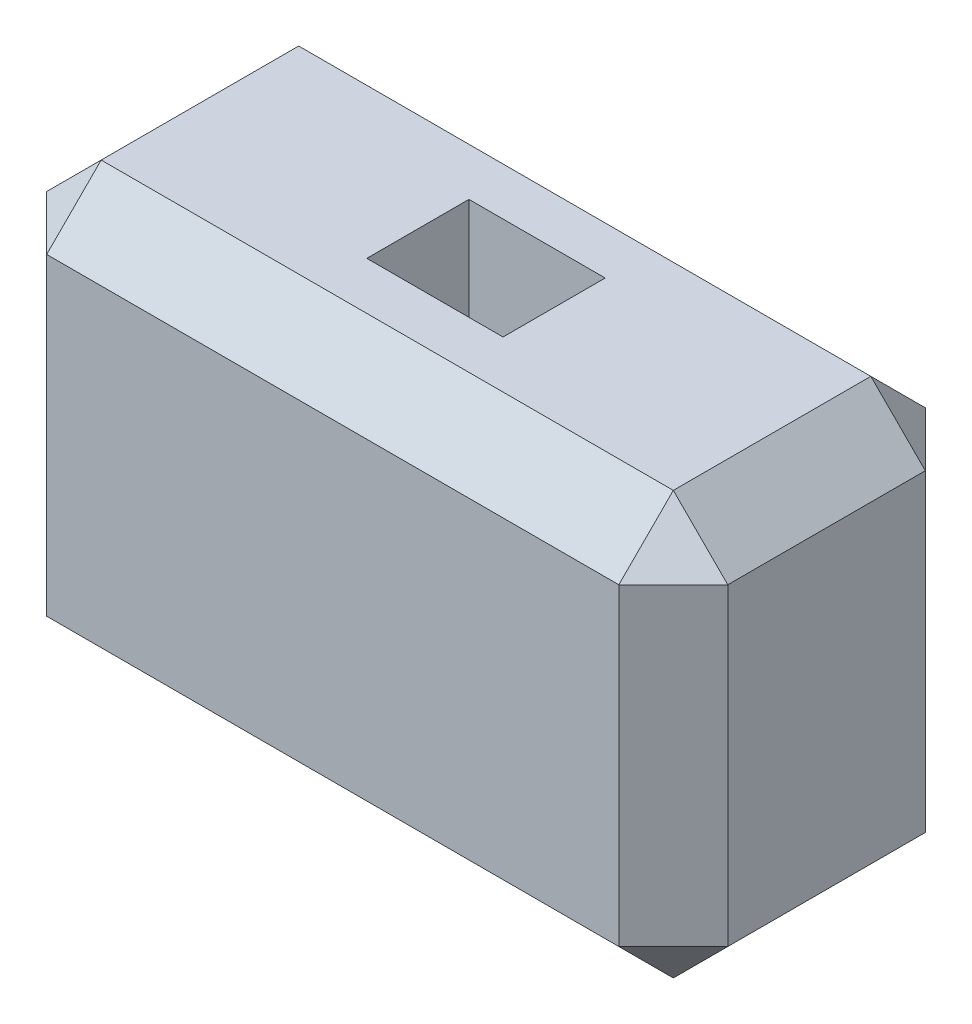
ISO-10303-21;
HEADER;
FILE_DESCRIPTION(('STEP AP214'),'2;1');
FILE_NAME('part.step','',(''),(''),'','','');
FILE_SCHEMA(('AUTOMOTIVE_DESIGN { 1 0 10303 214 1 1 1 1 }'));
ENDSEC;
DATA;
#1=APPLICATION_CONTEXT('core data for automotive mechanical design processes');
#2=APPLICATION_PROTOCOL_DEFINITION('international standard','automotive_design',2000,#1);
#3=PRODUCT_CONTEXT('',#1,'mechanical');
#4=PRODUCT('Part','Part','',(#3));
#5=PRODUCT_RELATED_PRODUCT_CATEGORY('part','',(#4));
#6=PRODUCT_DEFINITION_FORMATION('','',#4);
#7=PRODUCT_DEFINITION_CONTEXT('part definition',#1,'design');
#8=PRODUCT_DEFINITION('design','',#6,#7);
#9=PRODUCT_DEFINITION_SHAPE('','',#8);
#10=(LENGTH_UNIT() NAMED_UNIT(*) SI_UNIT(.MILLI.,.METRE.));
#11=(NAMED_UNIT(*) PLANE_ANGLE_UNIT() SI_UNIT($,.RADIAN.));
#12=(NAMED_UNIT(*) SI_UNIT($,.STERADIAN.) SOLID_ANGLE_UNIT());
#13=UNCERTAINTY_MEASURE_WITH_UNIT(LENGTH_MEASURE(1.E-05),#10,'distance_accuracy_value','');
#14=(GEOMETRIC_REPRESENTATION_CONTEXT(3) GLOBAL_UNCERTAINTY_ASSIGNED_CONTEXT((#13)) GLOBAL_UNIT_ASSIGNED_CONTEXT((#10,
#11,#12)) REPRESENTATION_CONTEXT('',''));
#15=CARTESIAN_POINT('',(0.,0.,0.));
#16=DIRECTION('',(0.,0.,1.));
#17=DIRECTION('',(1.,0.,0.));
#18=AXIS2_PLACEMENT_3D('',#15,#16,#17);
#19=CARTESIAN_POINT('',(0.,0.,19.05));
#20=DIRECTION('',(0.,0.,-1.));
#21=DIRECTION('',(-1.,0.,0.));
#22=AXIS2_PLACEMENT_3D('',#19,#20,#21);
#23=PLANE('',#22);
#24=DIRECTION('',(0.,-1.,0.));
#25=VECTOR('',#24,1.);
#26=CARTESIAN_POINT('',(12.7,39.37,19.05));
#27=LINE('',#26,#25);
#28=CARTESIAN_POINT('',(12.7,39.37,19.05));
#29=VERTEX_POINT('',#28);
#30=CARTESIAN_POINT('',(12.7,-39.37,19.05));
#31=VERTEX_POINT('',#30);
#32=EDGE_CURVE('E157',#29,#31,#27,.T.);
#33=ORIENTED_EDGE('',*,*,#32,.F.);
#34=DIRECTION('',(-1.,0.,0.));
#35=VECTOR('',#34,1.);
#36=CARTESIAN_POINT('',(-63.5,39.37,19.05));
#37=LINE('',#36,#35);
#38=CARTESIAN_POINT('',(-12.7,39.37,19.05));
#39=VERTEX_POINT('',#38);
#40=EDGE_CURVE('E165',#29,#39,#37,.T.);
#41=ORIENTED_EDGE('',*,*,#40,.T.);
#42=DIRECTION('',(0.,1.,0.));
#43=VECTOR('',#42,1.);
#44=CARTESIAN_POINT('',(-12.7,39.37,19.05));
#45=LINE('',#44,#43);
#46=CARTESIAN_POINT('',(-12.7,-39.37,19.05));
#47=VERTEX_POINT('',#46);
#48=EDGE_CURVE('E166',#47,#39,#45,.T.);
#49=ORIENTED_EDGE('',*,*,#48,.F.);
#50=DIRECTION('',(1.,0.,0.));
#51=VECTOR('',#50,1.);
#52=CARTESIAN_POINT('',(-63.5,-39.37,19.05));
#53=LINE('',#52,#51);
#54=EDGE_CURVE('E188',#47,#31,#53,.T.);
#55=ORIENTED_EDGE('',*,*,#54,.T.);
#56=EDGE_LOOP('',(#33,#41,#49,#55));
#57=FACE_BOUND('',#56,.T.);
#58=ADVANCED_FACE('F33',(#57),#23,.F.);
#59=CARTESIAN_POINT('',(63.5,-39.37,19.05));
#60=DIRECTION('',(-1.,0.,0.));
#61=DIRECTION('',(0.,0.,1.));
#62=AXIS2_PLACEMENT_3D('',#59,#60,#61);
#63=PLANE('',#62);
#64=DIRECTION('',(0.,-1.,0.));
#65=VECTOR('',#64,1.);
#66=CARTESIAN_POINT('',(63.5,-39.37,46.99));
#67=LINE('',#66,#65);
#68=CARTESIAN_POINT('',(63.5,29.21,46.99));
#69=VERTEX_POINT('',#68);
#70=CARTESIAN_POINT('',(63.5,-29.21,46.99));
#71=VERTEX_POINT('',#70);
#72=EDGE_CURVE('E234',#69,#71,#67,.T.);
#73=ORIENTED_EDGE('',*,*,#72,.T.);
#74=DIRECTION('',(0.,0.,-1.));
#75=VECTOR('',#74,1.);
#76=CARTESIAN_POINT('',(63.5,-29.21,19.05));
#77=LINE('',#76,#75);
#78=CARTESIAN_POINT('',(63.5,-29.21,10.16));
#79=VERTEX_POINT('',#78);
#80=EDGE_CURVE('E240',#71,#79,#77,.T.);
#81=ORIENTED_EDGE('',*,*,#80,.T.);
#82=DIRECTION('',(0.,1.,0.));
#83=VECTOR('',#82,1.);
#84=CARTESIAN_POINT('',(63.5,39.37,10.16));
#85=LINE('',#84,#83);
#86=CARTESIAN_POINT('',(63.5,29.21,10.16));
#87=VERTEX_POINT('',#86);
#88=EDGE_CURVE('E238',#79,#87,#85,.T.);
#89=ORIENTED_EDGE('',*,*,#88,.T.);
#90=DIRECTION('',(0.,0.,1.));
#91=VECTOR('',#90,1.);
#92=CARTESIAN_POINT('',(63.5,29.21,19.05));
#93=LINE('',#92,#91);
#94=EDGE_CURVE('E236',#87,#69,#93,.T.);
#95=ORIENTED_EDGE('',*,*,#94,.T.);
#96=EDGE_LOOP('',(#73,#81,#89,#95));
#97=FACE_BOUND('',#96,.T.);
#98=ADVANCED_FACE('F328',(#97),#63,.F.);
#99=CARTESIAN_POINT('',(-63.5,39.37,19.05));
#100=DIRECTION('',(0.,-1.,0.));
#101=DIRECTION('',(0.,0.,-1.));
#102=AXIS2_PLACEMENT_3D('',#99,#100,#101);
#103=PLANE('',#102);
#104=DIRECTION('',(1.,0.,0.));
#105=VECTOR('',#104,1.);
#106=CARTESIAN_POINT('',(63.5,39.37,46.99));
#107=LINE('',#106,#105);
#108=CARTESIAN_POINT('',(-53.34,39.37,46.99));
#109=VERTEX_POINT('',#108);
#110=CARTESIAN_POINT('',(53.34,39.37,46.99));
#111=VERTEX_POINT('',#110);
#112=EDGE_CURVE('E200',#109,#111,#107,.T.);
#113=ORIENTED_EDGE('',*,*,#112,.T.);
#114=DIRECTION('',(0.,0.,-1.));
#115=VECTOR('',#114,1.);
#116=CARTESIAN_POINT('',(53.34,39.37,19.05));
#117=LINE('',#116,#115);
#118=CARTESIAN_POINT('',(53.34,39.37,10.16));
#119=VERTEX_POINT('',#118);
#120=EDGE_CURVE('E205',#111,#119,#117,.T.);
#121=ORIENTED_EDGE('',*,*,#120,.T.);
#122=DIRECTION('',(-1.,0.,0.));
#123=VECTOR('',#122,1.);
#124=CARTESIAN_POINT('',(-63.5,39.37,10.16));
#125=LINE('',#124,#123);
#126=CARTESIAN_POINT('',(-53.34,39.37,10.16));
#127=VERTEX_POINT('',#126);
#128=EDGE_CURVE('E202',#119,#127,#125,.T.);
#129=ORIENTED_EDGE('',*,*,#128,.T.);
#130=DIRECTION('',(0.,0.,1.));
#131=VECTOR('',#130,1.);
#132=CARTESIAN_POINT('',(-53.34,39.37,19.05));
#133=LINE('',#132,#131);
#134=EDGE_CURVE('E198',#127,#109,#133,.T.);
#135=ORIENTED_EDGE('',*,*,#134,.T.);
#136=EDGE_LOOP('',(#113,#121,#129,#135));
#137=FACE_BOUND('',#136,.T.);
#138=DIRECTION('',(-1.,0.,0.));
#139=VECTOR('',#138,1.);
#140=CARTESIAN_POINT('',(-63.5,39.37,38.1));
#141=LINE('',#140,#139);
#142=CARTESIAN_POINT('',(12.7,39.37,38.1));
#143=VERTEX_POINT('',#142);
#144=CARTESIAN_POINT('',(-12.7,39.37,38.1));
#145=VERTEX_POINT('',#144);
#146=EDGE_CURVE('E164',#143,#145,#141,.T.);
#147=ORIENTED_EDGE('',*,*,#146,.T.);
#148=DIRECTION('',(0.,0.,-1.));
#149=VECTOR('',#148,1.);
#150=CARTESIAN_POINT('',(-12.7,39.37,38.1));
#151=LINE('',#150,#149);
#152=EDGE_CURVE('E179',#145,#39,#151,.T.);
#153=ORIENTED_EDGE('',*,*,#152,.T.);
#154=ORIENTED_EDGE('',*,*,#40,.F.);
#155=DIRECTION('',(0.,0.,-1.));
#156=VECTOR('',#155,1.);
#157=CARTESIAN_POINT('',(12.7,39.37,38.1));
#158=LINE('',#157,#156);
#159=EDGE_CURVE('E150',#143,#29,#158,.T.);
#160=ORIENTED_EDGE('',*,*,#159,.F.);
#161=EDGE_LOOP('',(#147,#153,#154,#160));
#162=FACE_BOUND('',#161,.T.);
#163=ADVANCED_FACE('F162',(#137,#162),#103,.F.);
#164=CARTESIAN_POINT('',(-63.5,-39.37,19.05));
#165=DIRECTION('',(1.,0.,0.));
#166=DIRECTION('',(0.,0.,-1.));
#167=AXIS2_PLACEMENT_3D('',#164,#165,#166);
#168=PLANE('',#167);
#169=DIRECTION('',(0.,1.,0.));
#170=VECTOR('',#169,1.);
#171=CARTESIAN_POINT('',(-63.5,39.37,46.99));
#172=LINE('',#171,#170);
#173=CARTESIAN_POINT('',(-63.5,-29.21,46.99));
#174=VERTEX_POINT('',#173);
#175=CARTESIAN_POINT('',(-63.5,29.21,46.99));
#176=VERTEX_POINT('',#175);
#177=EDGE_CURVE('E42',#174,#176,#172,.T.);
#178=ORIENTED_EDGE('',*,*,#177,.T.);
#179=DIRECTION('',(0.,0.,-1.));
#180=VECTOR('',#179,1.);
#181=CARTESIAN_POINT('',(-63.5,29.21,19.05));
#182=LINE('',#181,#180);
#183=CARTESIAN_POINT('',(-63.5,29.21,10.16));
#184=VERTEX_POINT('',#183);
#185=EDGE_CURVE('E11',#176,#184,#182,.T.);
#186=ORIENTED_EDGE('',*,*,#185,.T.);
#187=DIRECTION('',(0.,-1.,0.));
#188=VECTOR('',#187,1.);
#189=CARTESIAN_POINT('',(-63.5,-39.37,10.16));
#190=LINE('',#189,#188);
#191=CARTESIAN_POINT('',(-63.5,-29.21,10.16));
#192=VERTEX_POINT('',#191);
#193=EDGE_CURVE('E243',#184,#192,#190,.T.);
#194=ORIENTED_EDGE('',*,*,#193,.T.);
#195=DIRECTION('',(0.,0.,1.));
#196=VECTOR('',#195,1.);
#197=CARTESIAN_POINT('',(-63.5,-29.21,19.05));
#198=LINE('',#197,#196);
#199=EDGE_CURVE('E53',#192,#174,#198,.T.);
#200=ORIENTED_EDGE('',*,*,#199,.T.);
#201=EDGE_LOOP('',(#178,#186,#194,#200));
#202=FACE_BOUND('',#201,.T.);
#203=ADVANCED_FACE('F407',(#202),#168,.F.);
#204=CARTESIAN_POINT('',(-63.5,-39.37,19.05));
#205=DIRECTION('',(0.,1.,0.));
#206=DIRECTION('',(0.,0.,1.));
#207=AXIS2_PLACEMENT_3D('',#204,#205,#206);
#208=PLANE('',#207);
#209=DIRECTION('',(0.,0.,-1.));
#210=VECTOR('',#209,1.);
#211=CARTESIAN_POINT('',(-53.34,-39.37,19.05));
#212=LINE('',#211,#210);
#213=CARTESIAN_POINT('',(-53.34,-39.37,46.99));
#214=VERTEX_POINT('',#213);
#215=CARTESIAN_POINT('',(-53.34,-39.37,10.16));
#216=VERTEX_POINT('',#215);
#217=EDGE_CURVE('E216',#214,#216,#212,.T.);
#218=ORIENTED_EDGE('',*,*,#217,.T.);
#219=DIRECTION('',(1.,0.,0.));
#220=VECTOR('',#219,1.);
#221=CARTESIAN_POINT('',(63.5,-39.37,10.16));
#222=LINE('',#221,#220);
#223=CARTESIAN_POINT('',(53.34,-39.37,10.16));
#224=VERTEX_POINT('',#223);
#225=EDGE_CURVE('E222',#216,#224,#222,.T.);
#226=ORIENTED_EDGE('',*,*,#225,.T.);
#227=DIRECTION('',(0.,0.,1.));
#228=VECTOR('',#227,1.);
#229=CARTESIAN_POINT('',(53.34,-39.37,19.05));
#230=LINE('',#229,#228);
#231=CARTESIAN_POINT('',(53.34,-39.37,46.99));
#232=VERTEX_POINT('',#231);
#233=EDGE_CURVE('E220',#224,#232,#230,.T.);
#234=ORIENTED_EDGE('',*,*,#233,.T.);
#235=DIRECTION('',(-1.,0.,0.));
#236=VECTOR('',#235,1.);
#237=CARTESIAN_POINT('',(-63.5,-39.37,46.99));
#238=LINE('',#237,#236);
#239=EDGE_CURVE('E218',#232,#214,#238,.T.);
#240=ORIENTED_EDGE('',*,*,#239,.T.);
#241=EDGE_LOOP('',(#218,#226,#234,#240));
#242=FACE_BOUND('',#241,.T.);
#243=DIRECTION('',(0.,0.,-1.));
#244=VECTOR('',#243,1.);
#245=CARTESIAN_POINT('',(-12.7,-39.37,38.1));
#246=LINE('',#245,#244);
#247=CARTESIAN_POINT('',(-12.7,-39.37,38.1));
#248=VERTEX_POINT('',#247);
#249=EDGE_CURVE('E190',#248,#47,#246,.T.);
#250=ORIENTED_EDGE('',*,*,#249,.F.);
#251=DIRECTION('',(1.,0.,0.));
#252=VECTOR('',#251,1.);
#253=CARTESIAN_POINT('',(-63.5,-39.37,38.1));
#254=LINE('',#253,#252);
#255=CARTESIAN_POINT('',(12.7,-39.37,38.1));
#256=VERTEX_POINT('',#255);
#257=EDGE_CURVE('E172',#248,#256,#254,.T.);
#258=ORIENTED_EDGE('',*,*,#257,.T.);
#259=DIRECTION('',(0.,0.,-1.));
#260=VECTOR('',#259,1.);
#261=CARTESIAN_POINT('',(12.7,-39.37,38.1));
#262=LINE('',#261,#260);
#263=EDGE_CURVE('E152',#256,#31,#262,.T.);
#264=ORIENTED_EDGE('',*,*,#263,.T.);
#265=ORIENTED_EDGE('',*,*,#54,.F.);
#266=EDGE_LOOP('',(#250,#258,#264,#265));
#267=FACE_BOUND('',#266,.T.);
#268=ADVANCED_FACE('F355',(#242,#267),#208,.F.);
#269=CARTESIAN_POINT('',(0.,0.,0.));
#270=DIRECTION('',(0.,0.,-1.));
#271=DIRECTION('',(-1.,0.,0.));
#272=AXIS2_PLACEMENT_3D('',#269,#270,#271);
#273=PLANE('',#272);
#274=DIRECTION('',(1.,0.,0.));
#275=VECTOR('',#274,1.);
#276=CARTESIAN_POINT('',(63.5,29.21,0.));
#277=LINE('',#276,#275);
#278=CARTESIAN_POINT('',(-53.34,29.21,0.));
#279=VERTEX_POINT('',#278);
#280=CARTESIAN_POINT('',(53.34,29.21,0.));
#281=VERTEX_POINT('',#280);
#282=EDGE_CURVE('E211',#279,#281,#277,.T.);
#283=ORIENTED_EDGE('',*,*,#282,.T.);
#284=DIRECTION('',(0.,-1.,0.));
#285=VECTOR('',#284,1.);
#286=CARTESIAN_POINT('',(53.34,-39.37,0.));
#287=LINE('',#286,#285);
#288=CARTESIAN_POINT('',(53.34,-29.21,0.));
#289=VERTEX_POINT('',#288);
#290=EDGE_CURVE('E214',#281,#289,#287,.T.);
#291=ORIENTED_EDGE('',*,*,#290,.T.);
#292=DIRECTION('',(-1.,0.,0.));
#293=VECTOR('',#292,1.);
#294=CARTESIAN_POINT('',(-63.5,-29.21,0.));
#295=LINE('',#294,#293);
#296=CARTESIAN_POINT('',(-53.34,-29.21,0.));
#297=VERTEX_POINT('',#296);
#298=EDGE_CURVE('E209',#289,#297,#295,.T.);
#299=ORIENTED_EDGE('',*,*,#298,.T.);
#300=DIRECTION('',(0.,1.,0.));
#301=VECTOR('',#300,1.);
#302=CARTESIAN_POINT('',(-53.34,39.37,0.));
#303=LINE('',#302,#301);
#304=EDGE_CURVE('E207',#297,#279,#303,.T.);
#305=ORIENTED_EDGE('',*,*,#304,.T.);
#306=EDGE_LOOP('',(#283,#291,#299,#305));
#307=FACE_BOUND('',#306,.T.);
#308=ADVANCED_FACE('F401',(#307),#273,.T.);
#309=CARTESIAN_POINT('',(-12.7,39.37,38.1));
#310=DIRECTION('',(-1.,0.,0.));
#311=DIRECTION('',(0.,-1.,0.));
#312=AXIS2_PLACEMENT_3D('',#309,#310,#311);
#313=PLANE('',#312);
#314=ORIENTED_EDGE('',*,*,#48,.T.);
#315=ORIENTED_EDGE('',*,*,#152,.F.);
#316=DIRECTION('',(0.,1.,0.));
#317=VECTOR('',#316,1.);
#318=CARTESIAN_POINT('',(-12.7,39.37,38.1));
#319=LINE('',#318,#317);
#320=EDGE_CURVE('E171',#248,#145,#319,.T.);
#321=ORIENTED_EDGE('',*,*,#320,.F.);
#322=ORIENTED_EDGE('',*,*,#249,.T.);
#323=EDGE_LOOP('',(#314,#315,#321,#322));
#324=FACE_BOUND('',#323,.T.);
#325=ADVANCED_FACE('F399',(#324),#313,.F.);
#326=CARTESIAN_POINT('',(12.7,39.37,38.1));
#327=DIRECTION('',(1.,0.,0.));
#328=DIRECTION('',(0.,1.,0.));
#329=AXIS2_PLACEMENT_3D('',#326,#327,#328);
#330=PLANE('',#329);
#331=ORIENTED_EDGE('',*,*,#32,.T.);
#332=ORIENTED_EDGE('',*,*,#263,.F.);
#333=DIRECTION('',(0.,-1.,0.));
#334=VECTOR('',#333,1.);
#335=CARTESIAN_POINT('',(12.7,39.37,38.1));
#336=LINE('',#335,#334);
#337=EDGE_CURVE('E146',#143,#256,#336,.T.);
#338=ORIENTED_EDGE('',*,*,#337,.F.);
#339=ORIENTED_EDGE('',*,*,#159,.T.);
#340=EDGE_LOOP('',(#331,#332,#338,#339));
#341=FACE_BOUND('',#340,.T.);
#342=ADVANCED_FACE('F149',(#341),#330,.F.);
#343=CARTESIAN_POINT('',(0.,0.,38.1));
#344=DIRECTION('',(0.,0.,1.));
#345=DIRECTION('',(1.,0.,0.));
#346=AXIS2_PLACEMENT_3D('',#343,#344,#345);
#347=PLANE('',#346);
#348=ORIENTED_EDGE('',*,*,#257,.F.);
#349=ORIENTED_EDGE('',*,*,#320,.T.);
#350=ORIENTED_EDGE('',*,*,#146,.F.);
#351=ORIENTED_EDGE('',*,*,#337,.T.);
#352=EDGE_LOOP('',(#348,#349,#350,#351));
#353=FACE_BOUND('',#352,.T.);
#354=ADVANCED_FACE('F169',(#353),#347,.F.);
#355=CARTESIAN_POINT('',(0.,0.,57.15));
#356=DIRECTION('',(0.,0.,1.));
#357=DIRECTION('',(1.,0.,0.));
#358=AXIS2_PLACEMENT_3D('',#355,#356,#357);
#359=PLANE('',#358);
#360=DIRECTION('',(0.,1.,0.));
#361=VECTOR('',#360,1.);
#362=CARTESIAN_POINT('',(53.34,39.37,57.15));
#363=LINE('',#362,#361);
#364=CARTESIAN_POINT('',(53.34,-29.21,57.15));
#365=VERTEX_POINT('',#364);
#366=CARTESIAN_POINT('',(53.34,29.21,57.15));
#367=VERTEX_POINT('',#366);
#368=EDGE_CURVE('E229',#365,#367,#363,.T.);
#369=ORIENTED_EDGE('',*,*,#368,.T.);
#370=DIRECTION('',(-1.,0.,0.));
#371=VECTOR('',#370,1.);
#372=CARTESIAN_POINT('',(-63.5,29.21,57.15));
#373=LINE('',#372,#371);
#374=CARTESIAN_POINT('',(-53.34,29.21,57.15));
#375=VERTEX_POINT('',#374);
#376=EDGE_CURVE('E231',#367,#375,#373,.T.);
#377=ORIENTED_EDGE('',*,*,#376,.T.);
#378=DIRECTION('',(0.,-1.,0.));
#379=VECTOR('',#378,1.);
#380=CARTESIAN_POINT('',(-53.34,-39.37,57.15));
#381=LINE('',#380,#379);
#382=CARTESIAN_POINT('',(-53.34,-29.21,57.15));
#383=VERTEX_POINT('',#382);
#384=EDGE_CURVE('E225',#375,#383,#381,.T.);
#385=ORIENTED_EDGE('',*,*,#384,.T.);
#386=DIRECTION('',(1.,0.,0.));
#387=VECTOR('',#386,1.);
#388=CARTESIAN_POINT('',(63.5,-29.21,57.15));
#389=LINE('',#388,#387);
#390=EDGE_CURVE('E227',#383,#365,#389,.T.);
#391=ORIENTED_EDGE('',*,*,#390,.T.);
#392=EDGE_LOOP('',(#369,#377,#385,#391));
#393=FACE_BOUND('',#392,.T.);
#394=ADVANCED_FACE('F336',(#393),#359,.T.);
#395=CARTESIAN_POINT('',(0.,-29.21,57.15));
#396=DIRECTION('',(0.,-0.707106781186549,0.707106781186546));
#397=DIRECTION('',(-1.,0.,0.));
#398=AXIS2_PLACEMENT_3D('',#395,#396,#397);
#399=PLANE('',#398);
#400=DIRECTION('',(0.,-0.707106781186546,-0.707106781186549));
#401=VECTOR('',#400,1.);
#402=CARTESIAN_POINT('',(53.34,-39.37,46.99));
#403=LINE('',#402,#401);
#404=EDGE_CURVE('E37',#365,#232,#403,.T.);
#405=ORIENTED_EDGE('',*,*,#404,.F.);
#406=ORIENTED_EDGE('',*,*,#390,.F.);
#407=DIRECTION('',(0.,0.707106781186546,0.707106781186549));
#408=VECTOR('',#407,1.);
#409=CARTESIAN_POINT('',(-53.34,-39.37,46.99));
#410=LINE('',#409,#408);
#411=EDGE_CURVE('E306',#214,#383,#410,.T.);
#412=ORIENTED_EDGE('',*,*,#411,.F.);
#413=ORIENTED_EDGE('',*,*,#239,.F.);
#414=EDGE_LOOP('',(#405,#406,#412,#413));
#415=FACE_BOUND('',#414,.T.);
#416=ADVANCED_FACE('F35',(#415),#399,.T.);
#417=CARTESIAN_POINT('',(53.34,-39.37,46.99));
#418=DIRECTION('',(0.577350269189626,-0.577350269189628,0.577350269189623));
#419=DIRECTION('',(0.707106781186549,0.707106781186546,0.));
#420=AXIS2_PLACEMENT_3D('',#417,#418,#419);
#421=PLANE('',#420);
#422=DIRECTION('',(-0.707106781186546,0.,0.707106781186549));
#423=VECTOR('',#422,1.);
#424=CARTESIAN_POINT('',(58.42,-29.21,52.07));
#425=LINE('',#424,#423);
#426=EDGE_CURVE('E301',#365,#71,#425,.F.);
#427=ORIENTED_EDGE('',*,*,#426,.F.);
#428=ORIENTED_EDGE('',*,*,#404,.T.);
#429=DIRECTION('',(-0.707106781186549,-0.707106781186546,0.));
#430=VECTOR('',#429,1.);
#431=CARTESIAN_POINT('',(53.34,-39.37,46.99));
#432=LINE('',#431,#430);
#433=EDGE_CURVE('E304',#71,#232,#432,.T.);
#434=ORIENTED_EDGE('',*,*,#433,.F.);
#435=EDGE_LOOP('',(#427,#428,#434));
#436=FACE_BOUND('',#435,.T.);
#437=ADVANCED_FACE('F317',(#436),#421,.T.);
#438=CARTESIAN_POINT('',(-53.34,-39.37,46.99));
#439=DIRECTION('',(-0.577350269189623,-0.577350269189628,0.577350269189626));
#440=DIRECTION('',(0.,-0.707106781186546,-0.707106781186549));
#441=AXIS2_PLACEMENT_3D('',#438,#439,#440);
#442=PLANE('',#441);
#443=DIRECTION('',(-0.707106781186549,0.707106781186546,0.));
#444=VECTOR('',#443,1.);
#445=CARTESIAN_POINT('',(-53.34,-39.37,46.99));
#446=LINE('',#445,#444);
#447=EDGE_CURVE('E296',#214,#174,#446,.T.);
#448=ORIENTED_EDGE('',*,*,#447,.F.);
#449=ORIENTED_EDGE('',*,*,#411,.T.);
#450=DIRECTION('',(-0.707106781186549,0.,-0.707106781186546));
#451=VECTOR('',#450,1.);
#452=CARTESIAN_POINT('',(-58.42,-29.21,52.07));
#453=LINE('',#452,#451);
#454=EDGE_CURVE('E298',#174,#383,#453,.F.);
#455=ORIENTED_EDGE('',*,*,#454,.F.);
#456=EDGE_LOOP('',(#448,#449,#455));
#457=FACE_BOUND('',#456,.T.);
#458=ADVANCED_FACE('F349',(#457),#442,.T.);
#459=CARTESIAN_POINT('',(63.5,-29.21,19.05));
#460=DIRECTION('',(-0.707106781186546,0.707106781186549,0.));
#461=DIRECTION('',(0.,0.,-1.));
#462=AXIS2_PLACEMENT_3D('',#459,#460,#461);
#463=PLANE('',#462);
#464=ORIENTED_EDGE('',*,*,#433,.T.);
#465=ORIENTED_EDGE('',*,*,#233,.F.);
#466=DIRECTION('',(0.707106781186549,0.707106781186546,0.));
#467=VECTOR('',#466,1.);
#468=CARTESIAN_POINT('',(53.34,-39.37,10.16));
#469=LINE('',#468,#467);
#470=EDGE_CURVE('E291',#79,#224,#469,.F.);
#471=ORIENTED_EDGE('',*,*,#470,.F.);
#472=ORIENTED_EDGE('',*,*,#80,.F.);
#473=EDGE_LOOP('',(#464,#465,#471,#472));
#474=FACE_BOUND('',#473,.T.);
#475=ADVANCED_FACE('F325',(#474),#463,.F.);
#476=CARTESIAN_POINT('',(53.34,0.,57.15));
#477=DIRECTION('',(0.707106781186549,0.,0.707106781186546));
#478=DIRECTION('',(0.,-1.,0.));
#479=AXIS2_PLACEMENT_3D('',#476,#477,#478);
#480=PLANE('',#479);
#481=ORIENTED_EDGE('',*,*,#426,.T.);
#482=ORIENTED_EDGE('',*,*,#72,.F.);
#483=DIRECTION('',(0.707106781186546,0.,-0.707106781186549));
#484=VECTOR('',#483,1.);
#485=CARTESIAN_POINT('',(58.42,29.21,52.07));
#486=LINE('',#485,#484);
#487=EDGE_CURVE('E288',#367,#69,#486,.T.);
#488=ORIENTED_EDGE('',*,*,#487,.F.);
#489=ORIENTED_EDGE('',*,*,#368,.F.);
#490=EDGE_LOOP('',(#481,#482,#488,#489));
#491=FACE_BOUND('',#490,.T.);
#492=ADVANCED_FACE('F333',(#491),#480,.T.);
#493=CARTESIAN_POINT('',(0.,29.21,57.15));
#494=DIRECTION('',(0.,0.707106781186549,0.707106781186546));
#495=DIRECTION('',(1.,0.,0.));
#496=AXIS2_PLACEMENT_3D('',#493,#494,#495);
#497=PLANE('',#496);
#498=DIRECTION('',(0.,0.707106781186546,-0.707106781186549));
#499=VECTOR('',#498,1.);
#500=CARTESIAN_POINT('',(-53.34,29.21,57.15));
#501=LINE('',#500,#499);
#502=EDGE_CURVE('E282',#375,#109,#501,.T.);
#503=ORIENTED_EDGE('',*,*,#502,.F.);
#504=ORIENTED_EDGE('',*,*,#376,.F.);
#505=DIRECTION('',(0.,-0.707106781186546,0.707106781186549));
#506=VECTOR('',#505,1.);
#507=CARTESIAN_POINT('',(53.34,39.37,46.99));
#508=LINE('',#507,#506);
#509=EDGE_CURVE('E285',#111,#367,#508,.T.);
#510=ORIENTED_EDGE('',*,*,#509,.F.);
#511=ORIENTED_EDGE('',*,*,#112,.F.);
#512=EDGE_LOOP('',(#503,#504,#510,#511));
#513=FACE_BOUND('',#512,.T.);
#514=ADVANCED_FACE('F340',(#513),#497,.T.);
#515=CARTESIAN_POINT('',(-53.34,0.,57.15));
#516=DIRECTION('',(-0.707106781186546,0.,0.707106781186549));
#517=DIRECTION('',(0.,1.,0.));
#518=AXIS2_PLACEMENT_3D('',#515,#516,#517);
#519=PLANE('',#518);
#520=ORIENTED_EDGE('',*,*,#454,.T.);
#521=ORIENTED_EDGE('',*,*,#384,.F.);
#522=DIRECTION('',(0.707106781186549,0.,0.707106781186546));
#523=VECTOR('',#522,1.);
#524=CARTESIAN_POINT('',(-53.34,29.21,57.15));
#525=LINE('',#524,#523);
#526=EDGE_CURVE('E280',#176,#375,#525,.T.);
#527=ORIENTED_EDGE('',*,*,#526,.F.);
#528=ORIENTED_EDGE('',*,*,#177,.F.);
#529=EDGE_LOOP('',(#520,#521,#527,#528));
#530=FACE_BOUND('',#529,.T.);
#531=ADVANCED_FACE('F347',(#530),#519,.T.);
#532=CARTESIAN_POINT('',(-53.34,-39.37,19.05));
#533=DIRECTION('',(0.707106781186546,0.707106781186549,0.));
#534=DIRECTION('',(0.,0.,-1.));
#535=AXIS2_PLACEMENT_3D('',#532,#533,#534);
#536=PLANE('',#535);
#537=ORIENTED_EDGE('',*,*,#447,.T.);
#538=ORIENTED_EDGE('',*,*,#199,.F.);
#539=DIRECTION('',(0.707106781186549,-0.707106781186546,0.));
#540=VECTOR('',#539,1.);
#541=CARTESIAN_POINT('',(-58.42,-34.29,10.16));
#542=LINE('',#541,#540);
#543=EDGE_CURVE('E277',#216,#192,#542,.F.);
#544=ORIENTED_EDGE('',*,*,#543,.F.);
#545=ORIENTED_EDGE('',*,*,#217,.F.);
#546=EDGE_LOOP('',(#537,#538,#544,#545));
#547=FACE_BOUND('',#546,.T.);
#548=ADVANCED_FACE('F352',(#547),#536,.F.);
#549=CARTESIAN_POINT('',(-63.5,-39.37,10.16));
#550=DIRECTION('',(0.,-0.707106781186546,-0.707106781186549));
#551=DIRECTION('',(-1.,0.,0.));
#552=AXIS2_PLACEMENT_3D('',#549,#550,#551);
#553=PLANE('',#552);
#554=DIRECTION('',(0.,0.707106781186549,-0.707106781186546));
#555=VECTOR('',#554,1.);
#556=CARTESIAN_POINT('',(53.34,-39.37,10.16));
#557=LINE('',#556,#555);
#558=EDGE_CURVE('E293',#224,#289,#557,.T.);
#559=ORIENTED_EDGE('',*,*,#558,.F.);
#560=ORIENTED_EDGE('',*,*,#225,.F.);
#561=DIRECTION('',(0.,-0.707106781186549,0.707106781186546));
#562=VECTOR('',#561,1.);
#563=CARTESIAN_POINT('',(-53.34,-29.21,0.));
#564=LINE('',#563,#562);
#565=EDGE_CURVE('E274',#297,#216,#564,.T.);
#566=ORIENTED_EDGE('',*,*,#565,.F.);
#567=ORIENTED_EDGE('',*,*,#298,.F.);
#568=EDGE_LOOP('',(#559,#560,#566,#567));
#569=FACE_BOUND('',#568,.T.);
#570=ADVANCED_FACE('F360',(#569),#553,.T.);
#571=CARTESIAN_POINT('',(53.34,-39.37,10.16));
#572=DIRECTION('',(0.577350269189623,-0.577350269189626,-0.577350269189628));
#573=DIRECTION('',(0.,0.707106781186549,-0.707106781186546));
#574=AXIS2_PLACEMENT_3D('',#571,#572,#573);
#575=PLANE('',#574);
#576=ORIENTED_EDGE('',*,*,#470,.T.);
#577=ORIENTED_EDGE('',*,*,#558,.T.);
#578=DIRECTION('',(0.707106781186549,0.,0.707106781186546));
#579=VECTOR('',#578,1.);
#580=CARTESIAN_POINT('',(58.42,-29.21,5.08));
#581=LINE('',#580,#579);
#582=EDGE_CURVE('E271',#79,#289,#581,.F.);
#583=ORIENTED_EDGE('',*,*,#582,.F.);
#584=EDGE_LOOP('',(#576,#577,#583));
#585=FACE_BOUND('',#584,.T.);
#586=ADVANCED_FACE('F365',(#585),#575,.T.);
#587=CARTESIAN_POINT('',(53.34,39.37,46.99));
#588=DIRECTION('',(0.577350269189629,0.577350269189626,0.577350269189623));
#589=DIRECTION('',(-0.707106781186546,0.707106781186549,0.));
#590=AXIS2_PLACEMENT_3D('',#587,#588,#589);
#591=PLANE('',#590);
#592=ORIENTED_EDGE('',*,*,#509,.T.);
#593=ORIENTED_EDGE('',*,*,#487,.T.);
#594=DIRECTION('',(0.707106781186546,-0.707106781186549,0.));
#595=VECTOR('',#594,1.);
#596=CARTESIAN_POINT('',(53.34,39.37,46.99));
#597=LINE('',#596,#595);
#598=EDGE_CURVE('E268',#111,#69,#597,.T.);
#599=ORIENTED_EDGE('',*,*,#598,.F.);
#600=EDGE_LOOP('',(#592,#593,#599));
#601=FACE_BOUND('',#600,.T.);
#602=ADVANCED_FACE('F379',(#601),#591,.T.);
#603=CARTESIAN_POINT('',(-53.34,29.21,57.15));
#604=DIRECTION('',(-0.577350269189624,0.577350269189628,0.577350269189625));
#605=DIRECTION('',(0.,-0.707106781186546,0.707106781186549));
#606=AXIS2_PLACEMENT_3D('',#603,#604,#605);
#607=PLANE('',#606);
#608=ORIENTED_EDGE('',*,*,#526,.T.);
#609=ORIENTED_EDGE('',*,*,#502,.T.);
#610=DIRECTION('',(0.707106781186549,0.707106781186546,0.));
#611=VECTOR('',#610,1.);
#612=CARTESIAN_POINT('',(-58.42,34.29,46.99));
#613=LINE('',#612,#611);
#614=EDGE_CURVE('E265',#176,#109,#613,.T.);
#615=ORIENTED_EDGE('',*,*,#614,.F.);
#616=EDGE_LOOP('',(#608,#609,#615));
#617=FACE_BOUND('',#616,.T.);
#618=ADVANCED_FACE('F381',(#617),#607,.T.);
#619=CARTESIAN_POINT('',(-53.34,-29.21,0.));
#620=DIRECTION('',(-0.577350269189623,-0.577350269189626,-0.577350269189628));
#621=DIRECTION('',(0.,0.707106781186549,-0.707106781186546));
#622=AXIS2_PLACEMENT_3D('',#619,#620,#621);
#623=PLANE('',#622);
#624=ORIENTED_EDGE('',*,*,#565,.T.);
#625=ORIENTED_EDGE('',*,*,#543,.T.);
#626=DIRECTION('',(0.707106781186549,0.,-0.707106781186546));
#627=VECTOR('',#626,1.);
#628=CARTESIAN_POINT('',(-53.34,-29.21,0.));
#629=LINE('',#628,#627);
#630=EDGE_CURVE('E262',#297,#192,#629,.F.);
#631=ORIENTED_EDGE('',*,*,#630,.F.);
#632=EDGE_LOOP('',(#624,#625,#631));
#633=FACE_BOUND('',#632,.T.);
#634=ADVANCED_FACE('F387',(#633),#623,.T.);
#635=CARTESIAN_POINT('',(63.5,-39.37,10.16));
#636=DIRECTION('',(0.707106781186546,0.,-0.707106781186549));
#637=DIRECTION('',(0.,-1.,0.));
#638=AXIS2_PLACEMENT_3D('',#635,#636,#637);
#639=PLANE('',#638);
#640=ORIENTED_EDGE('',*,*,#582,.T.);
#641=ORIENTED_EDGE('',*,*,#290,.F.);
#642=DIRECTION('',(-0.707106781186549,0.,-0.707106781186546));
#643=VECTOR('',#642,1.);
#644=CARTESIAN_POINT('',(53.34,29.21,0.));
#645=LINE('',#644,#643);
#646=EDGE_CURVE('E259',#87,#281,#645,.T.);
#647=ORIENTED_EDGE('',*,*,#646,.F.);
#648=ORIENTED_EDGE('',*,*,#88,.F.);
#649=EDGE_LOOP('',(#640,#641,#647,#648));
#650=FACE_BOUND('',#649,.T.);
#651=ADVANCED_FACE('F368',(#650),#639,.T.);
#652=CARTESIAN_POINT('',(53.34,39.37,19.05));
#653=DIRECTION('',(-0.70710678118655,-0.707106781186546,0.));
#654=DIRECTION('',(0.,0.,-1.));
#655=AXIS2_PLACEMENT_3D('',#652,#653,#654);
#656=PLANE('',#655);
#657=ORIENTED_EDGE('',*,*,#598,.T.);
#658=ORIENTED_EDGE('',*,*,#94,.F.);
#659=DIRECTION('',(-0.707106781186546,0.707106781186549,0.));
#660=VECTOR('',#659,1.);
#661=CARTESIAN_POINT('',(58.42,34.29,10.16));
#662=LINE('',#661,#660);
#663=EDGE_CURVE('E256',#119,#87,#662,.F.);
#664=ORIENTED_EDGE('',*,*,#663,.F.);
#665=ORIENTED_EDGE('',*,*,#120,.F.);
#666=EDGE_LOOP('',(#657,#658,#664,#665));
#667=FACE_BOUND('',#666,.T.);
#668=ADVANCED_FACE('F377',(#667),#656,.F.);
#669=CARTESIAN_POINT('',(-63.5,29.21,19.05));
#670=DIRECTION('',(0.707106781186547,-0.707106781186549,0.));
#671=DIRECTION('',(0.,0.,-1.));
#672=AXIS2_PLACEMENT_3D('',#669,#670,#671);
#673=PLANE('',#672);
#674=ORIENTED_EDGE('',*,*,#614,.T.);
#675=ORIENTED_EDGE('',*,*,#134,.F.);
#676=DIRECTION('',(-0.707106781186548,-0.707106781186547,0.));
#677=VECTOR('',#676,1.);
#678=CARTESIAN_POINT('',(-53.34,39.37,10.16));
#679=LINE('',#678,#677);
#680=EDGE_CURVE('E253',#184,#127,#679,.F.);
#681=ORIENTED_EDGE('',*,*,#680,.F.);
#682=ORIENTED_EDGE('',*,*,#185,.F.);
#683=EDGE_LOOP('',(#674,#675,#681,#682));
#684=FACE_BOUND('',#683,.T.);
#685=ADVANCED_FACE('F426',(#684),#673,.F.);
#686=CARTESIAN_POINT('',(-63.5,-39.37,10.16));
#687=DIRECTION('',(-0.707106781186546,0.,-0.707106781186549));
#688=DIRECTION('',(0.,1.,0.));
#689=AXIS2_PLACEMENT_3D('',#686,#687,#688);
#690=PLANE('',#689);
#691=ORIENTED_EDGE('',*,*,#630,.T.);
#692=ORIENTED_EDGE('',*,*,#193,.F.);
#693=DIRECTION('',(-0.707106781186549,0.,0.707106781186546));
#694=VECTOR('',#693,1.);
#695=CARTESIAN_POINT('',(-58.42,29.21,5.07999999999999));
#696=LINE('',#695,#694);
#697=EDGE_CURVE('E251',#279,#184,#696,.T.);
#698=ORIENTED_EDGE('',*,*,#697,.F.);
#699=ORIENTED_EDGE('',*,*,#304,.F.);
#700=EDGE_LOOP('',(#691,#692,#698,#699));
#701=FACE_BOUND('',#700,.T.);
#702=ADVANCED_FACE('F423',(#701),#690,.T.);
#703=CARTESIAN_POINT('',(53.34,29.21,0.));
#704=DIRECTION('',(0.577350269189626,0.577350269189623,-0.577350269189628));
#705=DIRECTION('',(-0.707106781186548,0.,-0.707106781186547));
#706=AXIS2_PLACEMENT_3D('',#703,#704,#705);
#707=PLANE('',#706);
#708=ORIENTED_EDGE('',*,*,#663,.T.);
#709=ORIENTED_EDGE('',*,*,#646,.T.);
#710=DIRECTION('',(0.,0.707106781186549,0.707106781186546));
#711=VECTOR('',#710,1.);
#712=CARTESIAN_POINT('',(53.34,29.21,0.));
#713=LINE('',#712,#711);
#714=EDGE_CURVE('E249',#119,#281,#713,.F.);
#715=ORIENTED_EDGE('',*,*,#714,.F.);
#716=EDGE_LOOP('',(#708,#709,#715));
#717=FACE_BOUND('',#716,.T.);
#718=ADVANCED_FACE('F373',(#717),#707,.T.);
#719=CARTESIAN_POINT('',(-53.34,39.37,10.16));
#720=DIRECTION('',(-0.577350269189624,0.577350269189626,-0.577350269189628));
#721=DIRECTION('',(0.,0.707106781186549,0.707106781186546));
#722=AXIS2_PLACEMENT_3D('',#719,#720,#721);
#723=PLANE('',#722);
#724=ORIENTED_EDGE('',*,*,#697,.T.);
#725=ORIENTED_EDGE('',*,*,#680,.T.);
#726=DIRECTION('',(0.,-0.707106781186549,-0.707106781186546));
#727=VECTOR('',#726,1.);
#728=CARTESIAN_POINT('',(-53.34,39.37,10.16));
#729=LINE('',#728,#727);
#730=EDGE_CURVE('E247',#279,#127,#729,.F.);
#731=ORIENTED_EDGE('',*,*,#730,.F.);
#732=EDGE_LOOP('',(#724,#725,#731));
#733=FACE_BOUND('',#732,.T.);
#734=ADVANCED_FACE('F416',(#733),#723,.T.);
#735=CARTESIAN_POINT('',(-63.5,39.37,10.16));
#736=DIRECTION('',(0.,0.707106781186546,-0.707106781186549));
#737=DIRECTION('',(1.,0.,0.));
#738=AXIS2_PLACEMENT_3D('',#735,#736,#737);
#739=PLANE('',#738);
#740=ORIENTED_EDGE('',*,*,#714,.T.);
#741=ORIENTED_EDGE('',*,*,#282,.F.);
#742=ORIENTED_EDGE('',*,*,#730,.T.);
#743=ORIENTED_EDGE('',*,*,#128,.F.);
#744=EDGE_LOOP('',(#740,#741,#742,#743));
#745=FACE_BOUND('',#744,.T.);
#746=ADVANCED_FACE('F413',(#745),#739,.T.);
#747=CLOSED_SHELL('',(#58,#98,#163,#203,#268,#308,#325,#342,#354,#394,#416,#437,#458,#475,#492,
#514,#531,#548,#570,#586,#602,#618,#634,#651,#668,#685,#702,#718,#734,#746));
#748=MANIFOLD_SOLID_BREP('B2',#747);
#749=ADVANCED_BREP_SHAPE_REPRESENTATION('',(#18,#748),#14);
#750=SHAPE_DEFINITION_REPRESENTATION(#9,#749);
ENDSEC;
END-ISO-10303-21;
